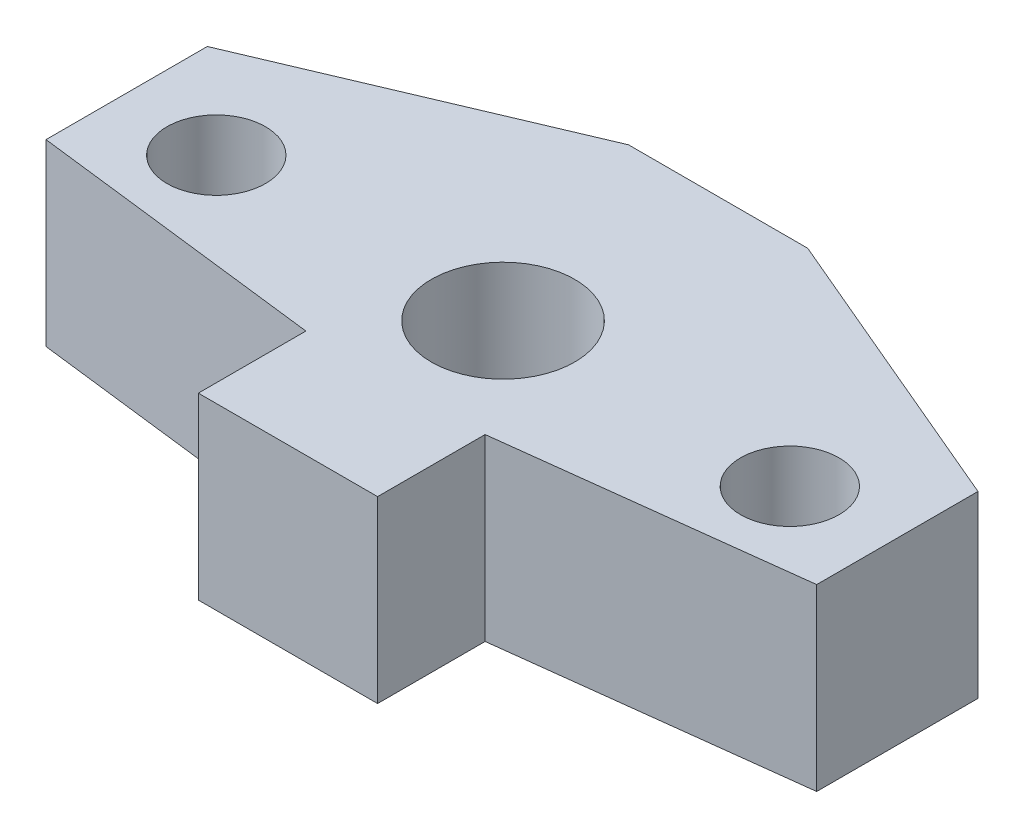
ISO-10303-21;
HEADER;
FILE_DESCRIPTION(('STEP AP214'),'2;1');
FILE_NAME('part.step','',(''),(''),'','','');
FILE_SCHEMA(('AUTOMOTIVE_DESIGN { 1 0 10303 214 1 1 1 1 }'));
ENDSEC;
DATA;
#1=APPLICATION_CONTEXT('core data for automotive mechanical design processes');
#2=APPLICATION_PROTOCOL_DEFINITION('international standard','automotive_design',2000,#1);
#3=PRODUCT_CONTEXT('',#1,'mechanical');
#4=PRODUCT('Part','Part','',(#3));
#5=PRODUCT_RELATED_PRODUCT_CATEGORY('part','',(#4));
#6=PRODUCT_DEFINITION_FORMATION('','',#4);
#7=PRODUCT_DEFINITION_CONTEXT('part definition',#1,'design');
#8=PRODUCT_DEFINITION('design','',#6,#7);
#9=PRODUCT_DEFINITION_SHAPE('','',#8);
#10=(LENGTH_UNIT() NAMED_UNIT(*) SI_UNIT(.MILLI.,.METRE.));
#11=(NAMED_UNIT(*) PLANE_ANGLE_UNIT() SI_UNIT($,.RADIAN.));
#12=(NAMED_UNIT(*) SI_UNIT($,.STERADIAN.) SOLID_ANGLE_UNIT());
#13=UNCERTAINTY_MEASURE_WITH_UNIT(LENGTH_MEASURE(1.E-05),#10,'distance_accuracy_value','');
#14=(GEOMETRIC_REPRESENTATION_CONTEXT(3) GLOBAL_UNCERTAINTY_ASSIGNED_CONTEXT((#13)) GLOBAL_UNIT_ASSIGNED_CONTEXT((#10,
#11,#12)) REPRESENTATION_CONTEXT('',''));
#15=CARTESIAN_POINT('',(0.,0.,0.));
#16=DIRECTION('',(0.,0.,1.));
#17=DIRECTION('',(1.,0.,0.));
#18=AXIS2_PLACEMENT_3D('',#15,#16,#17);
#19=CARTESIAN_POINT('',(0.,10.,0.));
#20=DIRECTION('',(0.,-1.,0.));
#21=DIRECTION('',(0.,0.,-1.));
#22=AXIS2_PLACEMENT_3D('',#19,#20,#21);
#23=PLANE('',#22);
#24=DIRECTION('',(-0.920581781875257,0.,-0.390549846856169));
#25=VECTOR('',#24,1.);
#26=CARTESIAN_POINT('',(43.,10.,-17.));
#27=LINE('',#26,#25);
#28=CARTESIAN_POINT('',(43.,10.,-17.));
#29=VERTEX_POINT('',#28);
#30=CARTESIAN_POINT('',(26.5,10.,-24.));
#31=VERTEX_POINT('',#30);
#32=EDGE_CURVE('E163',#29,#31,#27,.T.);
#33=ORIENTED_EDGE('',*,*,#32,.T.);
#34=DIRECTION('',(-1.,0.,0.));
#35=VECTOR('',#34,1.);
#36=CARTESIAN_POINT('',(16.5,10.,-24.));
#37=LINE('',#36,#35);
#38=CARTESIAN_POINT('',(16.5,10.,-24.));
#39=VERTEX_POINT('',#38);
#40=EDGE_CURVE('E101',#31,#39,#37,.T.);
#41=ORIENTED_EDGE('',*,*,#40,.T.);
#42=DIRECTION('',(-0.920581781875257,0.,0.390549846856169));
#43=VECTOR('',#42,1.);
#44=CARTESIAN_POINT('',(16.5,10.,-24.));
#45=LINE('',#44,#43);
#46=CARTESIAN_POINT('',(0.,10.,-17.));
#47=VERTEX_POINT('',#46);
#48=EDGE_CURVE('E184',#39,#47,#45,.T.);
#49=ORIENTED_EDGE('',*,*,#48,.T.);
#50=DIRECTION('',(0.,0.,1.));
#51=VECTOR('',#50,1.);
#52=CARTESIAN_POINT('',(0.,10.,-8.));
#53=LINE('',#52,#51);
#54=CARTESIAN_POINT('',(0.,10.,-8.));
#55=VERTEX_POINT('',#54);
#56=EDGE_CURVE('E203',#47,#55,#53,.T.);
#57=ORIENTED_EDGE('',*,*,#56,.T.);
#58=DIRECTION('',(0.992733782033708,0.,0.120331367519237));
#59=VECTOR('',#58,1.);
#60=CARTESIAN_POINT('',(16.5,10.,-6.));
#61=LINE('',#60,#59);
#62=CARTESIAN_POINT('',(16.5,10.,-6.));
#63=VERTEX_POINT('',#62);
#64=EDGE_CURVE('E200',#55,#63,#61,.T.);
#65=ORIENTED_EDGE('',*,*,#64,.T.);
#66=DIRECTION('',(0.,0.,1.));
#67=VECTOR('',#66,1.);
#68=CARTESIAN_POINT('',(16.5,10.,0.));
#69=LINE('',#68,#67);
#70=CARTESIAN_POINT('',(16.5,10.,0.));
#71=VERTEX_POINT('',#70);
#72=EDGE_CURVE('E202',#63,#71,#69,.T.);
#73=ORIENTED_EDGE('',*,*,#72,.T.);
#74=DIRECTION('',(1.,0.,0.));
#75=VECTOR('',#74,1.);
#76=CARTESIAN_POINT('',(16.5,10.,0.));
#77=LINE('',#76,#75);
#78=CARTESIAN_POINT('',(26.5,10.,0.));
#79=VERTEX_POINT('',#78);
#80=EDGE_CURVE('E126',#71,#79,#77,.T.);
#81=ORIENTED_EDGE('',*,*,#80,.T.);
#82=DIRECTION('',(0.,0.,-1.));
#83=VECTOR('',#82,1.);
#84=CARTESIAN_POINT('',(26.5,10.,0.));
#85=LINE('',#84,#83);
#86=CARTESIAN_POINT('',(26.5,10.,-6.));
#87=VERTEX_POINT('',#86);
#88=EDGE_CURVE('E120',#79,#87,#85,.T.);
#89=ORIENTED_EDGE('',*,*,#88,.T.);
#90=DIRECTION('',(0.992733782033708,0.,-0.120331367519237));
#91=VECTOR('',#90,1.);
#92=CARTESIAN_POINT('',(26.5,10.,-6.));
#93=LINE('',#92,#91);
#94=CARTESIAN_POINT('',(43.,10.,-8.));
#95=VERTEX_POINT('',#94);
#96=EDGE_CURVE('E124',#87,#95,#93,.T.);
#97=ORIENTED_EDGE('',*,*,#96,.T.);
#98=DIRECTION('',(0.,0.,-1.));
#99=VECTOR('',#98,1.);
#100=CARTESIAN_POINT('',(43.,10.,-8.));
#101=LINE('',#100,#99);
#102=EDGE_CURVE('E52',#95,#29,#101,.T.);
#103=ORIENTED_EDGE('',*,*,#102,.T.);
#104=EDGE_LOOP('',(#33,#41,#49,#57,#65,#73,#81,#89,#97,#103));
#105=FACE_BOUND('',#104,.T.);
#106=CARTESIAN_POINT('',(5.5,10.,-12.));
#107=DIRECTION('',(0.,1.,0.));
#108=DIRECTION('',(0.,0.,1.));
#109=AXIS2_PLACEMENT_3D('',#106,#107,#108);
#110=CIRCLE('',#109,2.75);
#111=CARTESIAN_POINT('',(5.5,10.,-9.25));
#112=VERTEX_POINT('',#111);
#113=EDGE_CURVE('E148',#112,#112,#110,.T.);
#114=ORIENTED_EDGE('',*,*,#113,.F.);
#115=EDGE_LOOP('',(#114));
#116=FACE_BOUND('',#115,.T.);
#117=CARTESIAN_POINT('',(37.5,10.,-12.));
#118=DIRECTION('',(0.,1.,0.));
#119=DIRECTION('',(0.,0.,1.));
#120=AXIS2_PLACEMENT_3D('',#117,#118,#119);
#121=CIRCLE('',#120,2.75);
#122=CARTESIAN_POINT('',(37.5,10.,-9.25));
#123=VERTEX_POINT('',#122);
#124=EDGE_CURVE('E214',#123,#123,#121,.T.);
#125=ORIENTED_EDGE('',*,*,#124,.F.);
#126=EDGE_LOOP('',(#125));
#127=FACE_BOUND('',#126,.T.);
#128=CARTESIAN_POINT('',(21.5,10.,-12.));
#129=DIRECTION('',(0.,1.,0.));
#130=DIRECTION('',(0.,0.,1.));
#131=AXIS2_PLACEMENT_3D('',#128,#129,#130);
#132=CIRCLE('',#131,4.);
#133=CARTESIAN_POINT('',(21.5,10.,-8.));
#134=VERTEX_POINT('',#133);
#135=EDGE_CURVE('E220',#134,#134,#132,.T.);
#136=ORIENTED_EDGE('',*,*,#135,.F.);
#137=EDGE_LOOP('',(#136));
#138=FACE_BOUND('',#137,.T.);
#139=ADVANCED_FACE('F35',(#105,#116,#127,#138),#23,.F.);
#140=CARTESIAN_POINT('',(0.,0.,0.));
#141=DIRECTION('',(0.,-1.,0.));
#142=DIRECTION('',(0.,0.,-1.));
#143=AXIS2_PLACEMENT_3D('',#140,#141,#142);
#144=PLANE('',#143);
#145=CARTESIAN_POINT('',(37.5,0.,-12.));
#146=DIRECTION('',(0.,1.,0.));
#147=DIRECTION('',(0.,0.,1.));
#148=AXIS2_PLACEMENT_3D('',#145,#146,#147);
#149=CIRCLE('',#148,2.75);
#150=CARTESIAN_POINT('',(37.5,0.,-9.25));
#151=VERTEX_POINT('',#150);
#152=EDGE_CURVE('E217',#151,#151,#149,.T.);
#153=ORIENTED_EDGE('',*,*,#152,.T.);
#154=EDGE_LOOP('',(#153));
#155=FACE_BOUND('',#154,.T.);
#156=DIRECTION('',(-0.920581781875257,0.,-0.390549846856169));
#157=VECTOR('',#156,1.);
#158=CARTESIAN_POINT('',(43.,0.,-17.));
#159=LINE('',#158,#157);
#160=CARTESIAN_POINT('',(43.,0.,-17.));
#161=VERTEX_POINT('',#160);
#162=CARTESIAN_POINT('',(26.5,0.,-24.));
#163=VERTEX_POINT('',#162);
#164=EDGE_CURVE('E144',#161,#163,#159,.T.);
#165=ORIENTED_EDGE('',*,*,#164,.F.);
#166=DIRECTION('',(0.,0.,-1.));
#167=VECTOR('',#166,1.);
#168=CARTESIAN_POINT('',(43.,0.,-8.));
#169=LINE('',#168,#167);
#170=CARTESIAN_POINT('',(43.,0.,-8.));
#171=VERTEX_POINT('',#170);
#172=EDGE_CURVE('E93',#171,#161,#169,.T.);
#173=ORIENTED_EDGE('',*,*,#172,.F.);
#174=DIRECTION('',(0.992733782033708,0.,-0.120331367519237));
#175=VECTOR('',#174,1.);
#176=CARTESIAN_POINT('',(26.5,0.,-6.));
#177=LINE('',#176,#175);
#178=CARTESIAN_POINT('',(26.5,0.,-6.));
#179=VERTEX_POINT('',#178);
#180=EDGE_CURVE('E87',#179,#171,#177,.T.);
#181=ORIENTED_EDGE('',*,*,#180,.F.);
#182=DIRECTION('',(0.,0.,-1.));
#183=VECTOR('',#182,1.);
#184=CARTESIAN_POINT('',(26.5,0.,0.));
#185=LINE('',#184,#183);
#186=CARTESIAN_POINT('',(26.5,0.,0.));
#187=VERTEX_POINT('',#186);
#188=EDGE_CURVE('E134',#187,#179,#185,.T.);
#189=ORIENTED_EDGE('',*,*,#188,.F.);
#190=DIRECTION('',(1.,0.,0.));
#191=VECTOR('',#190,1.);
#192=CARTESIAN_POINT('',(16.5,0.,0.));
#193=LINE('',#192,#191);
#194=CARTESIAN_POINT('',(16.5,0.,0.));
#195=VERTEX_POINT('',#194);
#196=EDGE_CURVE('E158',#195,#187,#193,.T.);
#197=ORIENTED_EDGE('',*,*,#196,.F.);
#198=DIRECTION('',(0.,0.,1.));
#199=VECTOR('',#198,1.);
#200=CARTESIAN_POINT('',(16.5,0.,0.));
#201=LINE('',#200,#199);
#202=CARTESIAN_POINT('',(16.5,0.,-6.));
#203=VERTEX_POINT('',#202);
#204=EDGE_CURVE('E156',#203,#195,#201,.T.);
#205=ORIENTED_EDGE('',*,*,#204,.F.);
#206=DIRECTION('',(0.992733782033708,0.,0.120331367519237));
#207=VECTOR('',#206,1.);
#208=CARTESIAN_POINT('',(16.5,0.,-6.));
#209=LINE('',#208,#207);
#210=CARTESIAN_POINT('',(0.,0.,-8.));
#211=VERTEX_POINT('',#210);
#212=EDGE_CURVE('E154',#211,#203,#209,.T.);
#213=ORIENTED_EDGE('',*,*,#212,.F.);
#214=DIRECTION('',(0.,0.,1.));
#215=VECTOR('',#214,1.);
#216=CARTESIAN_POINT('',(0.,0.,-8.));
#217=LINE('',#216,#215);
#218=CARTESIAN_POINT('',(0.,0.,-17.));
#219=VERTEX_POINT('',#218);
#220=EDGE_CURVE('E152',#219,#211,#217,.T.);
#221=ORIENTED_EDGE('',*,*,#220,.F.);
#222=DIRECTION('',(-0.920581781875257,0.,0.390549846856169));
#223=VECTOR('',#222,1.);
#224=CARTESIAN_POINT('',(16.5,0.,-24.));
#225=LINE('',#224,#223);
#226=CARTESIAN_POINT('',(16.5,0.,-24.));
#227=VERTEX_POINT('',#226);
#228=EDGE_CURVE('E150',#227,#219,#225,.T.);
#229=ORIENTED_EDGE('',*,*,#228,.F.);
#230=DIRECTION('',(-1.,0.,0.));
#231=VECTOR('',#230,1.);
#232=CARTESIAN_POINT('',(16.5,0.,-24.));
#233=LINE('',#232,#231);
#234=EDGE_CURVE('E147',#163,#227,#233,.T.);
#235=ORIENTED_EDGE('',*,*,#234,.F.);
#236=EDGE_LOOP('',(#165,#173,#181,#189,#197,#205,#213,#221,#229,#235));
#237=FACE_BOUND('',#236,.T.);
#238=CARTESIAN_POINT('',(5.5,0.,-12.));
#239=DIRECTION('',(0.,1.,0.));
#240=DIRECTION('',(0.,0.,1.));
#241=AXIS2_PLACEMENT_3D('',#238,#239,#240);
#242=CIRCLE('',#241,2.75);
#243=CARTESIAN_POINT('',(5.5,0.,-9.25));
#244=VERTEX_POINT('',#243);
#245=EDGE_CURVE('E211',#244,#244,#242,.T.);
#246=ORIENTED_EDGE('',*,*,#245,.T.);
#247=EDGE_LOOP('',(#246));
#248=FACE_BOUND('',#247,.T.);
#249=CARTESIAN_POINT('',(21.5,0.,-12.));
#250=DIRECTION('',(0.,1.,0.));
#251=DIRECTION('',(0.,0.,1.));
#252=AXIS2_PLACEMENT_3D('',#249,#250,#251);
#253=CIRCLE('',#252,4.);
#254=CARTESIAN_POINT('',(21.5,0.,-8.));
#255=VERTEX_POINT('',#254);
#256=EDGE_CURVE('E223',#255,#255,#253,.T.);
#257=ORIENTED_EDGE('',*,*,#256,.T.);
#258=EDGE_LOOP('',(#257));
#259=FACE_BOUND('',#258,.T.);
#260=ADVANCED_FACE('F188',(#155,#237,#248,#259),#144,.T.);
#261=CARTESIAN_POINT('',(43.,10.,-17.));
#262=DIRECTION('',(-0.390549846856169,0.,0.920581781875257));
#263=DIRECTION('',(0.920581781875257,0.,0.390549846856169));
#264=AXIS2_PLACEMENT_3D('',#261,#262,#263);
#265=PLANE('',#264);
#266=ORIENTED_EDGE('',*,*,#164,.T.);
#267=DIRECTION('',(0.,-1.,0.));
#268=VECTOR('',#267,1.);
#269=CARTESIAN_POINT('',(26.5,10.,-24.));
#270=LINE('',#269,#268);
#271=EDGE_CURVE('E11',#31,#163,#270,.T.);
#272=ORIENTED_EDGE('',*,*,#271,.F.);
#273=ORIENTED_EDGE('',*,*,#32,.F.);
#274=DIRECTION('',(0.,-1.,0.));
#275=VECTOR('',#274,1.);
#276=CARTESIAN_POINT('',(43.,10.,-17.));
#277=LINE('',#276,#275);
#278=EDGE_CURVE('E140',#29,#161,#277,.T.);
#279=ORIENTED_EDGE('',*,*,#278,.T.);
#280=EDGE_LOOP('',(#266,#272,#273,#279));
#281=FACE_BOUND('',#280,.T.);
#282=ADVANCED_FACE('F37',(#281),#265,.F.);
#283=CARTESIAN_POINT('',(16.5,10.,-24.));
#284=DIRECTION('',(0.,0.,1.));
#285=DIRECTION('',(1.,0.,0.));
#286=AXIS2_PLACEMENT_3D('',#283,#284,#285);
#287=PLANE('',#286);
#288=ORIENTED_EDGE('',*,*,#234,.T.);
#289=DIRECTION('',(0.,-1.,0.));
#290=VECTOR('',#289,1.);
#291=CARTESIAN_POINT('',(16.5,10.,-24.));
#292=LINE('',#291,#290);
#293=EDGE_CURVE('E44',#39,#227,#292,.T.);
#294=ORIENTED_EDGE('',*,*,#293,.F.);
#295=ORIENTED_EDGE('',*,*,#40,.F.);
#296=ORIENTED_EDGE('',*,*,#271,.T.);
#297=EDGE_LOOP('',(#288,#294,#295,#296));
#298=FACE_BOUND('',#297,.T.);
#299=ADVANCED_FACE('F263',(#298),#287,.F.);
#300=CARTESIAN_POINT('',(16.5,10.,-24.));
#301=DIRECTION('',(0.39054984685617,0.,0.920581781875257));
#302=DIRECTION('',(0.920581781875257,0.,-0.39054984685617));
#303=AXIS2_PLACEMENT_3D('',#300,#301,#302);
#304=PLANE('',#303);
#305=ORIENTED_EDGE('',*,*,#228,.T.);
#306=DIRECTION('',(0.,-1.,0.));
#307=VECTOR('',#306,1.);
#308=CARTESIAN_POINT('',(0.,10.,-17.));
#309=LINE('',#308,#307);
#310=EDGE_CURVE('E176',#47,#219,#309,.T.);
#311=ORIENTED_EDGE('',*,*,#310,.F.);
#312=ORIENTED_EDGE('',*,*,#48,.F.);
#313=ORIENTED_EDGE('',*,*,#293,.T.);
#314=EDGE_LOOP('',(#305,#311,#312,#313));
#315=FACE_BOUND('',#314,.T.);
#316=ADVANCED_FACE('F182',(#315),#304,.F.);
#317=CARTESIAN_POINT('',(0.,10.,-8.));
#318=DIRECTION('',(1.,0.,0.));
#319=DIRECTION('',(0.,0.,-1.));
#320=AXIS2_PLACEMENT_3D('',#317,#318,#319);
#321=PLANE('',#320);
#322=ORIENTED_EDGE('',*,*,#220,.T.);
#323=DIRECTION('',(0.,-1.,0.));
#324=VECTOR('',#323,1.);
#325=CARTESIAN_POINT('',(0.,10.,-8.));
#326=LINE('',#325,#324);
#327=EDGE_CURVE('E173',#55,#211,#326,.T.);
#328=ORIENTED_EDGE('',*,*,#327,.F.);
#329=ORIENTED_EDGE('',*,*,#56,.F.);
#330=ORIENTED_EDGE('',*,*,#310,.T.);
#331=EDGE_LOOP('',(#322,#328,#329,#330));
#332=FACE_BOUND('',#331,.T.);
#333=ADVANCED_FACE('F194',(#332),#321,.F.);
#334=CARTESIAN_POINT('',(16.5,10.,-6.));
#335=DIRECTION('',(0.120331367519237,0.,-0.992733782033708));
#336=DIRECTION('',(-0.992733782033708,0.,-0.120331367519237));
#337=AXIS2_PLACEMENT_3D('',#334,#335,#336);
#338=PLANE('',#337);
#339=ORIENTED_EDGE('',*,*,#212,.T.);
#340=DIRECTION('',(0.,-1.,0.));
#341=VECTOR('',#340,1.);
#342=CARTESIAN_POINT('',(16.5,10.,-6.));
#343=LINE('',#342,#341);
#344=EDGE_CURVE('E170',#63,#203,#343,.T.);
#345=ORIENTED_EDGE('',*,*,#344,.F.);
#346=ORIENTED_EDGE('',*,*,#64,.F.);
#347=ORIENTED_EDGE('',*,*,#327,.T.);
#348=EDGE_LOOP('',(#339,#345,#346,#347));
#349=FACE_BOUND('',#348,.T.);
#350=ADVANCED_FACE('F198',(#349),#338,.F.);
#351=CARTESIAN_POINT('',(16.5,10.,0.));
#352=DIRECTION('',(1.,0.,0.));
#353=DIRECTION('',(0.,0.,-1.));
#354=AXIS2_PLACEMENT_3D('',#351,#352,#353);
#355=PLANE('',#354);
#356=ORIENTED_EDGE('',*,*,#204,.T.);
#357=DIRECTION('',(0.,-1.,0.));
#358=VECTOR('',#357,1.);
#359=CARTESIAN_POINT('',(16.5,10.,0.));
#360=LINE('',#359,#358);
#361=EDGE_CURVE('E167',#71,#195,#360,.T.);
#362=ORIENTED_EDGE('',*,*,#361,.F.);
#363=ORIENTED_EDGE('',*,*,#72,.F.);
#364=ORIENTED_EDGE('',*,*,#344,.T.);
#365=EDGE_LOOP('',(#356,#362,#363,#364));
#366=FACE_BOUND('',#365,.T.);
#367=ADVANCED_FACE('F253',(#366),#355,.F.);
#368=CARTESIAN_POINT('',(16.5,10.,0.));
#369=DIRECTION('',(0.,0.,-1.));
#370=DIRECTION('',(-1.,0.,0.));
#371=AXIS2_PLACEMENT_3D('',#368,#369,#370);
#372=PLANE('',#371);
#373=ORIENTED_EDGE('',*,*,#196,.T.);
#374=DIRECTION('',(0.,-1.,0.));
#375=VECTOR('',#374,1.);
#376=CARTESIAN_POINT('',(26.5,10.,0.));
#377=LINE('',#376,#375);
#378=EDGE_CURVE('E135',#79,#187,#377,.T.);
#379=ORIENTED_EDGE('',*,*,#378,.F.);
#380=ORIENTED_EDGE('',*,*,#80,.F.);
#381=ORIENTED_EDGE('',*,*,#361,.T.);
#382=EDGE_LOOP('',(#373,#379,#380,#381));
#383=FACE_BOUND('',#382,.T.);
#384=ADVANCED_FACE('F250',(#383),#372,.F.);
#385=CARTESIAN_POINT('',(26.5,10.,0.));
#386=DIRECTION('',(-1.,0.,0.));
#387=DIRECTION('',(0.,0.,1.));
#388=AXIS2_PLACEMENT_3D('',#385,#386,#387);
#389=PLANE('',#388);
#390=ORIENTED_EDGE('',*,*,#188,.T.);
#391=DIRECTION('',(0.,-1.,0.));
#392=VECTOR('',#391,1.);
#393=CARTESIAN_POINT('',(26.5,10.,-6.));
#394=LINE('',#393,#392);
#395=EDGE_CURVE('E131',#87,#179,#394,.T.);
#396=ORIENTED_EDGE('',*,*,#395,.F.);
#397=ORIENTED_EDGE('',*,*,#88,.F.);
#398=ORIENTED_EDGE('',*,*,#378,.T.);
#399=EDGE_LOOP('',(#390,#396,#397,#398));
#400=FACE_BOUND('',#399,.T.);
#401=ADVANCED_FACE('F132',(#400),#389,.F.);
#402=CARTESIAN_POINT('',(26.5,10.,-6.));
#403=DIRECTION('',(-0.120331367519237,0.,-0.992733782033708));
#404=DIRECTION('',(-0.992733782033708,0.,0.120331367519237));
#405=AXIS2_PLACEMENT_3D('',#402,#403,#404);
#406=PLANE('',#405);
#407=ORIENTED_EDGE('',*,*,#180,.T.);
#408=DIRECTION('',(0.,-1.,0.));
#409=VECTOR('',#408,1.);
#410=CARTESIAN_POINT('',(43.,10.,-8.));
#411=LINE('',#410,#409);
#412=EDGE_CURVE('E136',#95,#171,#411,.T.);
#413=ORIENTED_EDGE('',*,*,#412,.F.);
#414=ORIENTED_EDGE('',*,*,#96,.F.);
#415=ORIENTED_EDGE('',*,*,#395,.T.);
#416=EDGE_LOOP('',(#407,#413,#414,#415));
#417=FACE_BOUND('',#416,.T.);
#418=ADVANCED_FACE('F138',(#417),#406,.F.);
#419=CARTESIAN_POINT('',(43.,10.,-8.));
#420=DIRECTION('',(-1.,0.,0.));
#421=DIRECTION('',(0.,0.,1.));
#422=AXIS2_PLACEMENT_3D('',#419,#420,#421);
#423=PLANE('',#422);
#424=ORIENTED_EDGE('',*,*,#172,.T.);
#425=ORIENTED_EDGE('',*,*,#278,.F.);
#426=ORIENTED_EDGE('',*,*,#102,.F.);
#427=ORIENTED_EDGE('',*,*,#412,.T.);
#428=EDGE_LOOP('',(#424,#425,#426,#427));
#429=FACE_BOUND('',#428,.T.);
#430=ADVANCED_FACE('F243',(#429),#423,.F.);
#431=CARTESIAN_POINT('',(5.5,10.,-12.));
#432=DIRECTION('',(0.,-1.,0.));
#433=DIRECTION('',(0.,0.,-1.));
#434=AXIS2_PLACEMENT_3D('',#431,#432,#433);
#435=CYLINDRICAL_SURFACE('',#434,2.75);
#436=ORIENTED_EDGE('',*,*,#113,.T.);
#437=EDGE_LOOP('',(#436));
#438=FACE_BOUND('',#437,.T.);
#439=ORIENTED_EDGE('',*,*,#245,.F.);
#440=EDGE_LOOP('',(#439));
#441=FACE_BOUND('',#440,.T.);
#442=ADVANCED_FACE('F240',(#438,#441),#435,.F.);
#443=CARTESIAN_POINT('',(37.5,10.,-12.));
#444=DIRECTION('',(0.,-1.,0.));
#445=DIRECTION('',(0.,0.,-1.));
#446=AXIS2_PLACEMENT_3D('',#443,#444,#445);
#447=CYLINDRICAL_SURFACE('',#446,2.75);
#448=ORIENTED_EDGE('',*,*,#124,.T.);
#449=EDGE_LOOP('',(#448));
#450=FACE_BOUND('',#449,.T.);
#451=ORIENTED_EDGE('',*,*,#152,.F.);
#452=EDGE_LOOP('',(#451));
#453=FACE_BOUND('',#452,.T.);
#454=ADVANCED_FACE('F339',(#450,#453),#447,.F.);
#455=CARTESIAN_POINT('',(21.5,10.,-12.));
#456=DIRECTION('',(0.,-1.,0.));
#457=DIRECTION('',(0.,0.,-1.));
#458=AXIS2_PLACEMENT_3D('',#455,#456,#457);
#459=CYLINDRICAL_SURFACE('',#458,4.);
#460=ORIENTED_EDGE('',*,*,#135,.T.);
#461=EDGE_LOOP('',(#460));
#462=FACE_BOUND('',#461,.T.);
#463=ORIENTED_EDGE('',*,*,#256,.F.);
#464=EDGE_LOOP('',(#463));
#465=FACE_BOUND('',#464,.T.);
#466=ADVANCED_FACE('F229',(#462,#465),#459,.F.);
#467=CLOSED_SHELL('',(#139,#260,#282,#299,#316,#333,#350,#367,#384,#401,#418,#430,#442,#454,#466));
#468=MANIFOLD_SOLID_BREP('B2',#467);
#469=ADVANCED_BREP_SHAPE_REPRESENTATION('',(#18,#468),#14);
#470=SHAPE_DEFINITION_REPRESENTATION(#9,#469);
ENDSEC;
END-ISO-10303-21;
